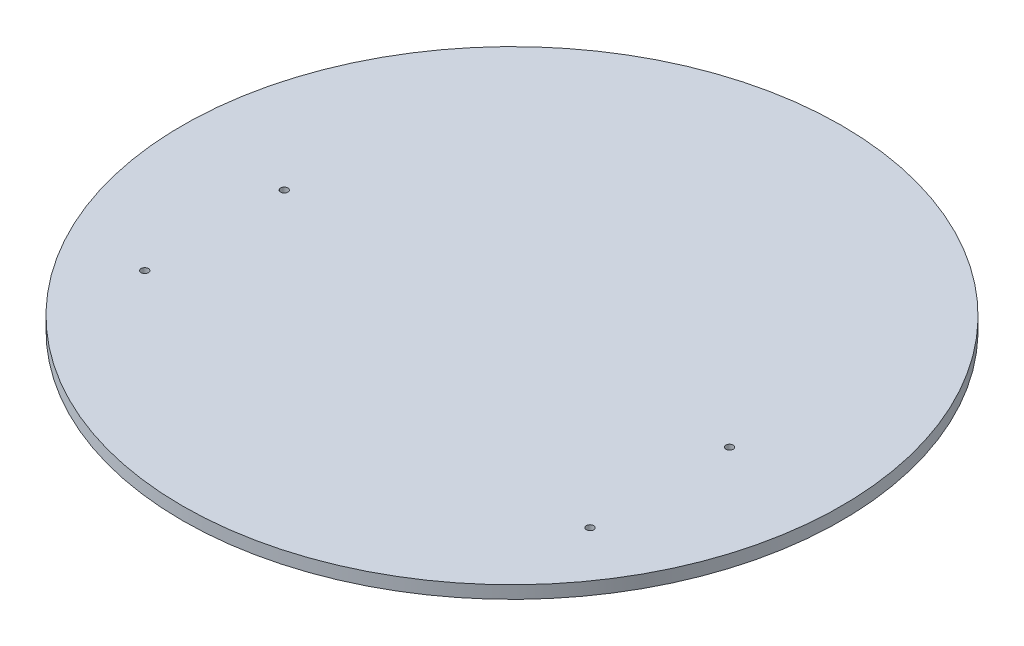
ISO-10303-21;
HEADER;
FILE_DESCRIPTION(('STEP AP214'),'2;1');
FILE_NAME('part.step','',(''),(''),'','','');
FILE_SCHEMA(('AUTOMOTIVE_DESIGN { 1 0 10303 214 1 1 1 1 }'));
ENDSEC;
DATA;
#1=APPLICATION_CONTEXT('core data for automotive mechanical design processes');
#2=APPLICATION_PROTOCOL_DEFINITION('international standard','automotive_design',2000,#1);
#3=PRODUCT_CONTEXT('',#1,'mechanical');
#4=PRODUCT('Part','Part','',(#3));
#5=PRODUCT_RELATED_PRODUCT_CATEGORY('part','',(#4));
#6=PRODUCT_DEFINITION_FORMATION('','',#4);
#7=PRODUCT_DEFINITION_CONTEXT('part definition',#1,'design');
#8=PRODUCT_DEFINITION('design','',#6,#7);
#9=PRODUCT_DEFINITION_SHAPE('','',#8);
#10=(LENGTH_UNIT() NAMED_UNIT(*) SI_UNIT(.MILLI.,.METRE.));
#11=(NAMED_UNIT(*) PLANE_ANGLE_UNIT() SI_UNIT($,.RADIAN.));
#12=(NAMED_UNIT(*) SI_UNIT($,.STERADIAN.) SOLID_ANGLE_UNIT());
#13=UNCERTAINTY_MEASURE_WITH_UNIT(LENGTH_MEASURE(1.E-05),#10,'distance_accuracy_value','');
#14=(GEOMETRIC_REPRESENTATION_CONTEXT(3) GLOBAL_UNCERTAINTY_ASSIGNED_CONTEXT((#13)) GLOBAL_UNIT_ASSIGNED_CONTEXT((#10,
#11,#12)) REPRESENTATION_CONTEXT('',''));
#15=CARTESIAN_POINT('',(0.,0.,0.));
#16=DIRECTION('',(0.,0.,1.));
#17=DIRECTION('',(1.,0.,0.));
#18=AXIS2_PLACEMENT_3D('',#15,#16,#17);
#19=CARTESIAN_POINT('',(0.,6.35,0.));
#20=DIRECTION('',(0.,-1.,0.));
#21=DIRECTION('',(0.,0.,-1.));
#22=AXIS2_PLACEMENT_3D('',#19,#20,#21);
#23=CYLINDRICAL_SURFACE('',#22,164.975);
#24=CARTESIAN_POINT('',(0.,6.35,0.));
#25=DIRECTION('',(0.,1.,0.));
#26=DIRECTION('',(0.,0.,1.));
#27=AXIS2_PLACEMENT_3D('',#24,#25,#26);
#28=CIRCLE('',#27,164.975);
#29=CARTESIAN_POINT('',(0.,6.35,164.975));
#30=VERTEX_POINT('',#29);
#31=EDGE_CURVE('E10',#30,#30,#28,.T.);
#32=ORIENTED_EDGE('',*,*,#31,.F.);
#33=EDGE_LOOP('',(#32));
#34=FACE_BOUND('',#33,.T.);
#35=CARTESIAN_POINT('',(0.,0.,0.));
#36=DIRECTION('',(0.,1.,0.));
#37=DIRECTION('',(0.,0.,1.));
#38=AXIS2_PLACEMENT_3D('',#35,#36,#37);
#39=CIRCLE('',#38,164.975);
#40=CARTESIAN_POINT('',(0.,0.,164.975));
#41=VERTEX_POINT('',#40);
#42=EDGE_CURVE('E36',#41,#41,#39,.T.);
#43=ORIENTED_EDGE('',*,*,#42,.T.);
#44=EDGE_LOOP('',(#43));
#45=FACE_BOUND('',#44,.T.);
#46=ADVANCED_FACE('F33',(#34,#45),#23,.T.);
#47=CARTESIAN_POINT('',(0.,6.35,0.));
#48=DIRECTION('',(0.,1.,0.));
#49=DIRECTION('',(0.,0.,1.));
#50=AXIS2_PLACEMENT_3D('',#47,#48,#49);
#51=PLANE('',#50);
#52=CARTESIAN_POINT('',(111.465,6.35,72.39));
#53=DIRECTION('',(0.,-1.,0.));
#54=DIRECTION('',(0.,0.,-1.));
#55=AXIS2_PLACEMENT_3D('',#52,#53,#54);
#56=CIRCLE('',#55,1.82879999999999);
#57=CARTESIAN_POINT('',(111.465,6.35,70.5612));
#58=VERTEX_POINT('',#57);
#59=EDGE_CURVE('E62',#58,#58,#56,.T.);
#60=ORIENTED_EDGE('',*,*,#59,.T.);
#61=EDGE_LOOP('',(#60));
#62=FACE_BOUND('',#61,.T.);
#63=CARTESIAN_POINT('',(111.465,6.35,2.54));
#64=DIRECTION('',(0.,-1.,0.));
#65=DIRECTION('',(0.,0.,-1.));
#66=AXIS2_PLACEMENT_3D('',#63,#64,#65);
#67=CIRCLE('',#66,1.82879999999999);
#68=CARTESIAN_POINT('',(111.465,6.35,0.711200000000009));
#69=VERTEX_POINT('',#68);
#70=EDGE_CURVE('E56',#69,#69,#67,.T.);
#71=ORIENTED_EDGE('',*,*,#70,.T.);
#72=EDGE_LOOP('',(#71));
#73=FACE_BOUND('',#72,.T.);
#74=CARTESIAN_POINT('',(-111.465,6.35,72.39));
#75=DIRECTION('',(0.,-1.,0.));
#76=DIRECTION('',(0.,0.,-1.));
#77=AXIS2_PLACEMENT_3D('',#74,#75,#76);
#78=CIRCLE('',#77,1.82879999999999);
#79=CARTESIAN_POINT('',(-111.465,6.35,70.5612));
#80=VERTEX_POINT('',#79);
#81=EDGE_CURVE('E50',#80,#80,#78,.T.);
#82=ORIENTED_EDGE('',*,*,#81,.T.);
#83=EDGE_LOOP('',(#82));
#84=FACE_BOUND('',#83,.T.);
#85=CARTESIAN_POINT('',(-111.465,6.35,2.54));
#86=DIRECTION('',(0.,-1.,0.));
#87=DIRECTION('',(0.,0.,-1.));
#88=AXIS2_PLACEMENT_3D('',#85,#86,#87);
#89=CIRCLE('',#88,1.82879999999999);
#90=CARTESIAN_POINT('',(-111.465,6.35,0.711200000000009));
#91=VERTEX_POINT('',#90);
#92=EDGE_CURVE('E43',#91,#91,#89,.T.);
#93=ORIENTED_EDGE('',*,*,#92,.T.);
#94=EDGE_LOOP('',(#93));
#95=FACE_BOUND('',#94,.T.);
#96=ORIENTED_EDGE('',*,*,#31,.T.);
#97=EDGE_LOOP('',(#96));
#98=FACE_BOUND('',#97,.T.);
#99=ADVANCED_FACE('F75',(#62,#73,#84,#95,#98),#51,.T.);
#100=CARTESIAN_POINT('',(0.,0.,0.));
#101=DIRECTION('',(0.,1.,0.));
#102=DIRECTION('',(0.,0.,1.));
#103=AXIS2_PLACEMENT_3D('',#100,#101,#102);
#104=PLANE('',#103);
#105=CARTESIAN_POINT('',(111.465,0.,72.39));
#106=DIRECTION('',(0.,-1.,0.));
#107=DIRECTION('',(0.,0.,-1.));
#108=AXIS2_PLACEMENT_3D('',#105,#106,#107);
#109=CIRCLE('',#108,1.82879999999999);
#110=CARTESIAN_POINT('',(111.465,0.,70.5612));
#111=VERTEX_POINT('',#110);
#112=EDGE_CURVE('E65',#111,#111,#109,.T.);
#113=ORIENTED_EDGE('',*,*,#112,.F.);
#114=EDGE_LOOP('',(#113));
#115=FACE_BOUND('',#114,.T.);
#116=CARTESIAN_POINT('',(111.465,0.,2.54));
#117=DIRECTION('',(0.,-1.,0.));
#118=DIRECTION('',(0.,0.,-1.));
#119=AXIS2_PLACEMENT_3D('',#116,#117,#118);
#120=CIRCLE('',#119,1.82879999999999);
#121=CARTESIAN_POINT('',(111.465,0.,0.711200000000009));
#122=VERTEX_POINT('',#121);
#123=EDGE_CURVE('E59',#122,#122,#120,.T.);
#124=ORIENTED_EDGE('',*,*,#123,.F.);
#125=EDGE_LOOP('',(#124));
#126=FACE_BOUND('',#125,.T.);
#127=CARTESIAN_POINT('',(-111.465,0.,72.39));
#128=DIRECTION('',(0.,-1.,0.));
#129=DIRECTION('',(0.,0.,-1.));
#130=AXIS2_PLACEMENT_3D('',#127,#128,#129);
#131=CIRCLE('',#130,1.82879999999999);
#132=CARTESIAN_POINT('',(-111.465,0.,70.5612));
#133=VERTEX_POINT('',#132);
#134=EDGE_CURVE('E53',#133,#133,#131,.T.);
#135=ORIENTED_EDGE('',*,*,#134,.F.);
#136=EDGE_LOOP('',(#135));
#137=FACE_BOUND('',#136,.T.);
#138=CARTESIAN_POINT('',(-111.465,0.,2.54));
#139=DIRECTION('',(0.,-1.,0.));
#140=DIRECTION('',(0.,0.,-1.));
#141=AXIS2_PLACEMENT_3D('',#138,#139,#140);
#142=CIRCLE('',#141,1.82879999999999);
#143=CARTESIAN_POINT('',(-111.465,0.,0.711200000000009));
#144=VERTEX_POINT('',#143);
#145=EDGE_CURVE('E47',#144,#144,#142,.T.);
#146=ORIENTED_EDGE('',*,*,#145,.F.);
#147=EDGE_LOOP('',(#146));
#148=FACE_BOUND('',#147,.T.);
#149=ORIENTED_EDGE('',*,*,#42,.F.);
#150=EDGE_LOOP('',(#149));
#151=FACE_BOUND('',#150,.T.);
#152=ADVANCED_FACE('F71',(#115,#126,#137,#148,#151),#104,.F.);
#153=CARTESIAN_POINT('',(-111.465,0.,2.54));
#154=DIRECTION('',(0.,-1.,0.));
#155=DIRECTION('',(0.,0.,-1.));
#156=AXIS2_PLACEMENT_3D('',#153,#154,#155);
#157=CYLINDRICAL_SURFACE('',#156,1.82879999999999);
#158=ORIENTED_EDGE('',*,*,#92,.F.);
#159=EDGE_LOOP('',(#158));
#160=FACE_BOUND('',#159,.T.);
#161=ORIENTED_EDGE('',*,*,#145,.T.);
#162=EDGE_LOOP('',(#161));
#163=FACE_BOUND('',#162,.T.);
#164=ADVANCED_FACE('F74',(#160,#163),#157,.F.);
#165=CARTESIAN_POINT('',(-111.465,0.,72.39));
#166=DIRECTION('',(0.,-1.,0.));
#167=DIRECTION('',(0.,0.,-1.));
#168=AXIS2_PLACEMENT_3D('',#165,#166,#167);
#169=CYLINDRICAL_SURFACE('',#168,1.82879999999999);
#170=ORIENTED_EDGE('',*,*,#81,.F.);
#171=EDGE_LOOP('',(#170));
#172=FACE_BOUND('',#171,.T.);
#173=ORIENTED_EDGE('',*,*,#134,.T.);
#174=EDGE_LOOP('',(#173));
#175=FACE_BOUND('',#174,.T.);
#176=ADVANCED_FACE('F97',(#172,#175),#169,.F.);
#177=CARTESIAN_POINT('',(111.465,0.,2.54));
#178=DIRECTION('',(0.,-1.,0.));
#179=DIRECTION('',(0.,0.,-1.));
#180=AXIS2_PLACEMENT_3D('',#177,#178,#179);
#181=CYLINDRICAL_SURFACE('',#180,1.82879999999999);
#182=ORIENTED_EDGE('',*,*,#70,.F.);
#183=EDGE_LOOP('',(#182));
#184=FACE_BOUND('',#183,.T.);
#185=ORIENTED_EDGE('',*,*,#123,.T.);
#186=EDGE_LOOP('',(#185));
#187=FACE_BOUND('',#186,.T.);
#188=ADVANCED_FACE('F101',(#184,#187),#181,.F.);
#189=CARTESIAN_POINT('',(111.465,0.,72.39));
#190=DIRECTION('',(0.,-1.,0.));
#191=DIRECTION('',(0.,0.,-1.));
#192=AXIS2_PLACEMENT_3D('',#189,#190,#191);
#193=CYLINDRICAL_SURFACE('',#192,1.82879999999999);
#194=ORIENTED_EDGE('',*,*,#59,.F.);
#195=EDGE_LOOP('',(#194));
#196=FACE_BOUND('',#195,.T.);
#197=ORIENTED_EDGE('',*,*,#112,.T.);
#198=EDGE_LOOP('',(#197));
#199=FACE_BOUND('',#198,.T.);
#200=ADVANCED_FACE('F69',(#196,#199),#193,.F.);
#201=CLOSED_SHELL('',(#46,#99,#152,#164,#176,#188,#200));
#202=MANIFOLD_SOLID_BREP('B2',#201);
#203=ADVANCED_BREP_SHAPE_REPRESENTATION('',(#18,#202),#14);
#204=SHAPE_DEFINITION_REPRESENTATION(#9,#203);
ENDSEC;
END-ISO-10303-21;
